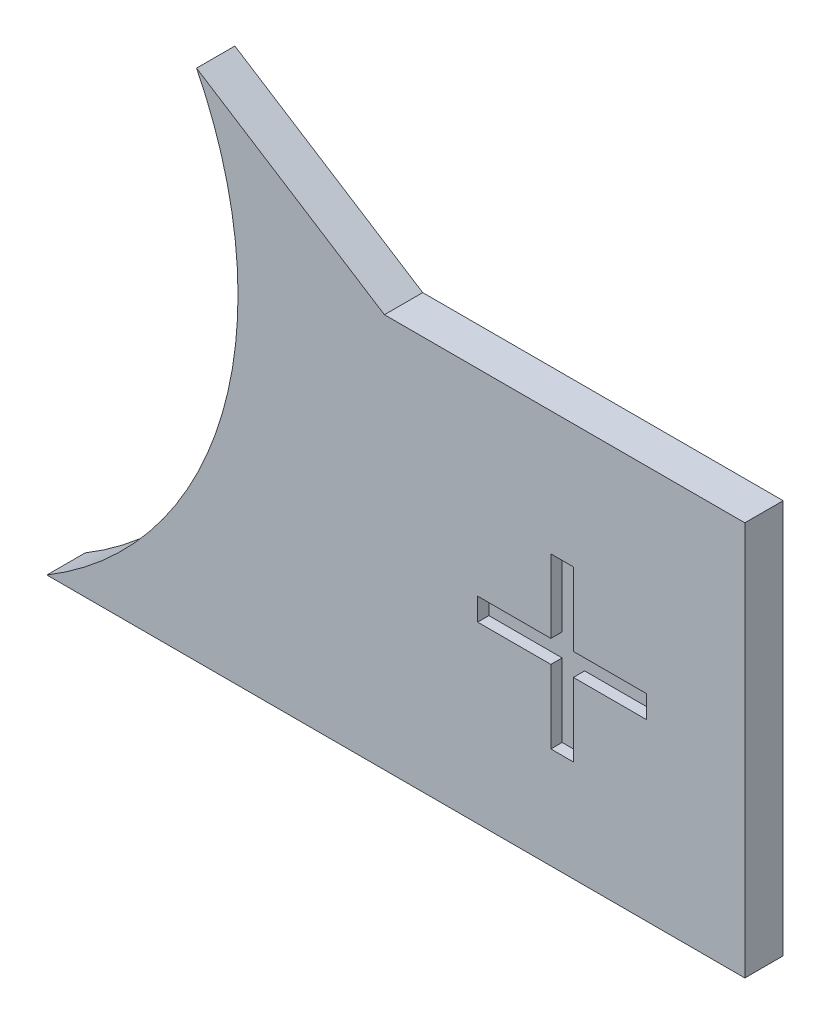
ISO-10303-21;
HEADER;
FILE_DESCRIPTION(('STEP AP214'),'2;1');
FILE_NAME('part.step','',(''),(''),'','','');
FILE_SCHEMA(('AUTOMOTIVE_DESIGN { 1 0 10303 214 1 1 1 1 }'));
ENDSEC;
DATA;
#1=APPLICATION_CONTEXT('core data for automotive mechanical design processes');
#2=APPLICATION_PROTOCOL_DEFINITION('international standard','automotive_design',2000,#1);
#3=PRODUCT_CONTEXT('',#1,'mechanical');
#4=PRODUCT('Part','Part','',(#3));
#5=PRODUCT_RELATED_PRODUCT_CATEGORY('part','',(#4));
#6=PRODUCT_DEFINITION_FORMATION('','',#4);
#7=PRODUCT_DEFINITION_CONTEXT('part definition',#1,'design');
#8=PRODUCT_DEFINITION('design','',#6,#7);
#9=PRODUCT_DEFINITION_SHAPE('','',#8);
#10=(LENGTH_UNIT() NAMED_UNIT(*) SI_UNIT(.MILLI.,.METRE.));
#11=(NAMED_UNIT(*) PLANE_ANGLE_UNIT() SI_UNIT($,.RADIAN.));
#12=(NAMED_UNIT(*) SI_UNIT($,.STERADIAN.) SOLID_ANGLE_UNIT());
#13=UNCERTAINTY_MEASURE_WITH_UNIT(LENGTH_MEASURE(1.E-05),#10,'distance_accuracy_value','');
#14=(GEOMETRIC_REPRESENTATION_CONTEXT(3) GLOBAL_UNCERTAINTY_ASSIGNED_CONTEXT((#13)) GLOBAL_UNIT_ASSIGNED_CONTEXT((#10,
#11,#12)) REPRESENTATION_CONTEXT('',''));
#15=CARTESIAN_POINT('',(0.,0.,0.));
#16=DIRECTION('',(0.,0.,1.));
#17=DIRECTION('',(1.,0.,0.));
#18=AXIS2_PLACEMENT_3D('',#15,#16,#17);
#19=CARTESIAN_POINT('',(0.,0.,3.4));
#20=DIRECTION('',(0.,0.,1.));
#21=DIRECTION('',(1.,0.,0.));
#22=AXIS2_PLACEMENT_3D('',#19,#20,#21);
#23=PLANE('',#22);
#24=CARTESIAN_POINT('',(0.,0.,3.4));
#25=DIRECTION('',(0.,0.,1.));
#26=DIRECTION('',(1.,0.,0.));
#27=AXIS2_PLACEMENT_3D('',#24,#25,#26);
#28=CIRCLE('',#27,35.);
#29=CARTESIAN_POINT('',(18.02775637732,-30.,3.4));
#30=VERTEX_POINT('',#29);
#31=CARTESIAN_POINT('',(31.3204115569061,15.6215178489808,3.4));
#32=VERTEX_POINT('',#31);
#33=EDGE_CURVE('E59',#30,#32,#28,.T.);
#34=ORIENTED_EDGE('',*,*,#33,.F.);
#35=DIRECTION('',(1.,0.,0.));
#36=VECTOR('',#35,1.);
#37=CARTESIAN_POINT('',(0.,-30.,3.4));
#38=LINE('',#37,#36);
#39=CARTESIAN_POINT('',(80.,-30.,3.4));
#40=VERTEX_POINT('',#39);
#41=EDGE_CURVE('E261',#30,#40,#38,.T.);
#42=ORIENTED_EDGE('',*,*,#41,.T.);
#43=DIRECTION('',(0.,1.,0.));
#44=VECTOR('',#43,1.);
#45=CARTESIAN_POINT('',(80.,-30.,3.4));
#46=LINE('',#45,#44);
#47=CARTESIAN_POINT('',(80.,5.,3.4));
#48=VERTEX_POINT('',#47);
#49=EDGE_CURVE('E263',#40,#48,#46,.T.);
#50=ORIENTED_EDGE('',*,*,#49,.T.);
#51=DIRECTION('',(-1.,0.,0.));
#52=VECTOR('',#51,1.);
#53=CARTESIAN_POINT('',(80.,5.,3.4));
#54=LINE('',#53,#52);
#55=CARTESIAN_POINT('',(48.,5.,3.4));
#56=VERTEX_POINT('',#55);
#57=EDGE_CURVE('E266',#48,#56,#54,.T.);
#58=ORIENTED_EDGE('',*,*,#57,.T.);
#59=DIRECTION('',(-0.843495742575284,0.537135860148408,0.));
#60=VECTOR('',#59,1.);
#61=CARTESIAN_POINT('',(48.,5.,3.4));
#62=LINE('',#61,#60);
#63=EDGE_CURVE('E268',#56,#32,#62,.T.);
#64=ORIENTED_EDGE('',*,*,#63,.T.);
#65=EDGE_LOOP('',(#34,#42,#50,#58,#64));
#66=FACE_BOUND('',#65,.T.);
#67=DIRECTION('',(-1.,0.,0.));
#68=VECTOR('',#67,1.);
#69=CARTESIAN_POINT('',(0.,-14.5,3.4));
#70=LINE('',#69,#68);
#71=CARTESIAN_POINT('',(71.2753826404039,-14.5,3.4));
#72=VERTEX_POINT('',#71);
#73=CARTESIAN_POINT('',(64.7753826404039,-14.5,3.4));
#74=VERTEX_POINT('',#73);
#75=EDGE_CURVE('E205',#72,#74,#70,.T.);
#76=ORIENTED_EDGE('',*,*,#75,.T.);
#77=DIRECTION('',(0.,-1.,0.));
#78=VECTOR('',#77,1.);
#79=CARTESIAN_POINT('',(64.7753826404039,0.,3.4));
#80=LINE('',#79,#78);
#81=CARTESIAN_POINT('',(64.7753826404039,-21.,3.4));
#82=VERTEX_POINT('',#81);
#83=EDGE_CURVE('E51',#74,#82,#80,.T.);
#84=ORIENTED_EDGE('',*,*,#83,.T.);
#85=DIRECTION('',(-1.,0.,0.));
#86=VECTOR('',#85,1.);
#87=CARTESIAN_POINT('',(0.,-21.,3.4));
#88=LINE('',#87,#86);
#89=CARTESIAN_POINT('',(62.7753826404039,-21.,3.4));
#90=VERTEX_POINT('',#89);
#91=EDGE_CURVE('E175',#82,#90,#88,.T.);
#92=ORIENTED_EDGE('',*,*,#91,.T.);
#93=DIRECTION('',(0.,-1.,0.));
#94=VECTOR('',#93,1.);
#95=CARTESIAN_POINT('',(62.7753826404039,0.,3.4));
#96=LINE('',#95,#94);
#97=CARTESIAN_POINT('',(62.7753826404039,-14.5,3.4));
#98=VERTEX_POINT('',#97);
#99=EDGE_CURVE('E178',#98,#90,#96,.T.);
#100=ORIENTED_EDGE('',*,*,#99,.F.);
#101=DIRECTION('',(-1.,0.,0.));
#102=VECTOR('',#101,1.);
#103=CARTESIAN_POINT('',(0.,-14.5,3.4));
#104=LINE('',#103,#102);
#105=CARTESIAN_POINT('',(56.2753826404039,-14.5,3.4));
#106=VERTEX_POINT('',#105);
#107=EDGE_CURVE('E228',#98,#106,#104,.T.);
#108=ORIENTED_EDGE('',*,*,#107,.T.);
#109=DIRECTION('',(0.,-1.,0.));
#110=VECTOR('',#109,1.);
#111=CARTESIAN_POINT('',(56.2753826404039,0.,3.4));
#112=LINE('',#111,#110);
#113=CARTESIAN_POINT('',(56.2753826404039,-12.5,3.4));
#114=VERTEX_POINT('',#113);
#115=EDGE_CURVE('E225',#114,#106,#112,.T.);
#116=ORIENTED_EDGE('',*,*,#115,.F.);
#117=DIRECTION('',(-1.,0.,0.));
#118=VECTOR('',#117,1.);
#119=CARTESIAN_POINT('',(0.,-12.5,3.4));
#120=LINE('',#119,#118);
#121=CARTESIAN_POINT('',(62.7753826404039,-12.5,3.4));
#122=VERTEX_POINT('',#121);
#123=EDGE_CURVE('E222',#122,#114,#120,.T.);
#124=ORIENTED_EDGE('',*,*,#123,.F.);
#125=DIRECTION('',(0.,-1.,0.));
#126=VECTOR('',#125,1.);
#127=CARTESIAN_POINT('',(62.7753826404039,0.,3.4));
#128=LINE('',#127,#126);
#129=CARTESIAN_POINT('',(62.7753826404039,-6.00000000000001,3.4));
#130=VERTEX_POINT('',#129);
#131=EDGE_CURVE('E219',#130,#122,#128,.T.);
#132=ORIENTED_EDGE('',*,*,#131,.F.);
#133=DIRECTION('',(-1.,0.,0.));
#134=VECTOR('',#133,1.);
#135=CARTESIAN_POINT('',(0.,-6.00000000000001,3.4));
#136=LINE('',#135,#134);
#137=CARTESIAN_POINT('',(64.7753826404039,-6.00000000000001,3.4));
#138=VERTEX_POINT('',#137);
#139=EDGE_CURVE('E216',#138,#130,#136,.T.);
#140=ORIENTED_EDGE('',*,*,#139,.F.);
#141=DIRECTION('',(0.,-1.,0.));
#142=VECTOR('',#141,1.);
#143=CARTESIAN_POINT('',(64.7753826404039,0.,3.4));
#144=LINE('',#143,#142);
#145=CARTESIAN_POINT('',(64.7753826404039,-12.5,3.4));
#146=VERTEX_POINT('',#145);
#147=EDGE_CURVE('E213',#138,#146,#144,.T.);
#148=ORIENTED_EDGE('',*,*,#147,.T.);
#149=DIRECTION('',(-1.,0.,0.));
#150=VECTOR('',#149,1.);
#151=CARTESIAN_POINT('',(0.,-12.5,3.4));
#152=LINE('',#151,#150);
#153=CARTESIAN_POINT('',(71.2753826404039,-12.5,3.4));
#154=VERTEX_POINT('',#153);
#155=EDGE_CURVE('E210',#154,#146,#152,.T.);
#156=ORIENTED_EDGE('',*,*,#155,.F.);
#157=DIRECTION('',(0.,-1.,0.));
#158=VECTOR('',#157,1.);
#159=CARTESIAN_POINT('',(71.2753826404039,0.,3.4));
#160=LINE('',#159,#158);
#161=EDGE_CURVE('E207',#154,#72,#160,.T.);
#162=ORIENTED_EDGE('',*,*,#161,.T.);
#163=EDGE_LOOP('',(#76,#84,#92,#100,#108,#116,#124,#132,#140,#148,#156,#162));
#164=FACE_BOUND('',#163,.T.);
#165=ADVANCED_FACE('F36',(#66,#164),#23,.T.);
#166=CARTESIAN_POINT('',(0.,0.,0.));
#167=DIRECTION('',(0.,0.,1.));
#168=DIRECTION('',(1.,0.,0.));
#169=AXIS2_PLACEMENT_3D('',#166,#167,#168);
#170=PLANE('',#169);
#171=DIRECTION('',(1.,0.,0.));
#172=VECTOR('',#171,1.);
#173=CARTESIAN_POINT('',(0.,-30.,0.));
#174=LINE('',#173,#172);
#175=CARTESIAN_POINT('',(18.02775637732,-30.,0.));
#176=VERTEX_POINT('',#175);
#177=CARTESIAN_POINT('',(80.,-30.,0.));
#178=VERTEX_POINT('',#177);
#179=EDGE_CURVE('E260',#176,#178,#174,.T.);
#180=ORIENTED_EDGE('',*,*,#179,.F.);
#181=CARTESIAN_POINT('',(0.,0.,0.));
#182=DIRECTION('',(0.,0.,-1.));
#183=DIRECTION('',(-1.,0.,0.));
#184=AXIS2_PLACEMENT_3D('',#181,#182,#183);
#185=CIRCLE('',#184,35.);
#186=CARTESIAN_POINT('',(31.3204115569061,15.6215178489808,0.));
#187=VERTEX_POINT('',#186);
#188=EDGE_CURVE('E235',#187,#176,#185,.T.);
#189=ORIENTED_EDGE('',*,*,#188,.F.);
#190=DIRECTION('',(-0.843495742575284,0.537135860148408,0.));
#191=VECTOR('',#190,1.);
#192=CARTESIAN_POINT('',(48.,5.,0.));
#193=LINE('',#192,#191);
#194=CARTESIAN_POINT('',(48.,5.,0.));
#195=VERTEX_POINT('',#194);
#196=EDGE_CURVE('E264',#195,#187,#193,.T.);
#197=ORIENTED_EDGE('',*,*,#196,.F.);
#198=DIRECTION('',(-1.,0.,0.));
#199=VECTOR('',#198,1.);
#200=CARTESIAN_POINT('',(80.,5.,0.));
#201=LINE('',#200,#199);
#202=CARTESIAN_POINT('',(80.,5.,0.));
#203=VERTEX_POINT('',#202);
#204=EDGE_CURVE('E275',#203,#195,#201,.T.);
#205=ORIENTED_EDGE('',*,*,#204,.F.);
#206=DIRECTION('',(0.,1.,0.));
#207=VECTOR('',#206,1.);
#208=CARTESIAN_POINT('',(80.,-30.,0.));
#209=LINE('',#208,#207);
#210=EDGE_CURVE('E273',#178,#203,#209,.T.);
#211=ORIENTED_EDGE('',*,*,#210,.F.);
#212=EDGE_LOOP('',(#180,#189,#197,#205,#211));
#213=FACE_BOUND('',#212,.T.);
#214=ADVANCED_FACE('F295',(#213),#170,.F.);
#215=CARTESIAN_POINT('',(0.,-30.,3.4));
#216=DIRECTION('',(0.,1.,0.));
#217=DIRECTION('',(-1.,0.,0.));
#218=AXIS2_PLACEMENT_3D('',#215,#216,#217);
#219=PLANE('',#218);
#220=ORIENTED_EDGE('',*,*,#41,.F.);
#221=DIRECTION('',(0.,0.,-1.));
#222=VECTOR('',#221,1.);
#223=CARTESIAN_POINT('',(18.02775637732,-30.,10.));
#224=LINE('',#223,#222);
#225=EDGE_CURVE('E257',#30,#176,#224,.T.);
#226=ORIENTED_EDGE('',*,*,#225,.T.);
#227=ORIENTED_EDGE('',*,*,#179,.T.);
#228=DIRECTION('',(0.,0.,-1.));
#229=VECTOR('',#228,1.);
#230=CARTESIAN_POINT('',(80.,-30.,3.4));
#231=LINE('',#230,#229);
#232=EDGE_CURVE('E44',#40,#178,#231,.T.);
#233=ORIENTED_EDGE('',*,*,#232,.F.);
#234=EDGE_LOOP('',(#220,#226,#227,#233));
#235=FACE_BOUND('',#234,.T.);
#236=ADVANCED_FACE('F38',(#235),#219,.F.);
#237=CARTESIAN_POINT('',(80.,-30.,3.4));
#238=DIRECTION('',(-1.,0.,0.));
#239=DIRECTION('',(0.,0.,1.));
#240=AXIS2_PLACEMENT_3D('',#237,#238,#239);
#241=PLANE('',#240);
#242=ORIENTED_EDGE('',*,*,#210,.T.);
#243=DIRECTION('',(0.,0.,-1.));
#244=VECTOR('',#243,1.);
#245=CARTESIAN_POINT('',(80.,5.,3.4));
#246=LINE('',#245,#244);
#247=EDGE_CURVE('E281',#48,#203,#246,.T.);
#248=ORIENTED_EDGE('',*,*,#247,.F.);
#249=ORIENTED_EDGE('',*,*,#49,.F.);
#250=ORIENTED_EDGE('',*,*,#232,.T.);
#251=EDGE_LOOP('',(#242,#248,#249,#250));
#252=FACE_BOUND('',#251,.T.);
#253=ADVANCED_FACE('F288',(#252),#241,.F.);
#254=CARTESIAN_POINT('',(80.,5.,3.4));
#255=DIRECTION('',(0.,-1.,0.));
#256=DIRECTION('',(1.,0.,0.));
#257=AXIS2_PLACEMENT_3D('',#254,#255,#256);
#258=PLANE('',#257);
#259=ORIENTED_EDGE('',*,*,#204,.T.);
#260=DIRECTION('',(0.,0.,-1.));
#261=VECTOR('',#260,1.);
#262=CARTESIAN_POINT('',(48.,5.,3.4));
#263=LINE('',#262,#261);
#264=EDGE_CURVE('E271',#56,#195,#263,.T.);
#265=ORIENTED_EDGE('',*,*,#264,.F.);
#266=ORIENTED_EDGE('',*,*,#57,.F.);
#267=ORIENTED_EDGE('',*,*,#247,.T.);
#268=EDGE_LOOP('',(#259,#265,#266,#267));
#269=FACE_BOUND('',#268,.T.);
#270=ADVANCED_FACE('F300',(#269),#258,.F.);
#271=CARTESIAN_POINT('',(48.,5.,3.4));
#272=DIRECTION('',(-0.537135860148408,-0.843495742575284,0.));
#273=DIRECTION('',(0.843495742575284,-0.537135860148408,0.));
#274=AXIS2_PLACEMENT_3D('',#271,#272,#273);
#275=PLANE('',#274);
#276=ORIENTED_EDGE('',*,*,#196,.T.);
#277=DIRECTION('',(0.,0.,-1.));
#278=VECTOR('',#277,1.);
#279=CARTESIAN_POINT('',(31.3204115569061,15.6215178489808,10.));
#280=LINE('',#279,#278);
#281=EDGE_CURVE('E11',#187,#32,#280,.F.);
#282=ORIENTED_EDGE('',*,*,#281,.T.);
#283=ORIENTED_EDGE('',*,*,#63,.F.);
#284=ORIENTED_EDGE('',*,*,#264,.T.);
#285=EDGE_LOOP('',(#276,#282,#283,#284));
#286=FACE_BOUND('',#285,.T.);
#287=ADVANCED_FACE('F304',(#286),#275,.F.);
#288=CARTESIAN_POINT('',(0.,0.,10.));
#289=DIRECTION('',(0.,0.,-1.));
#290=DIRECTION('',(-1.,0.,0.));
#291=AXIS2_PLACEMENT_3D('',#288,#289,#290);
#292=CYLINDRICAL_SURFACE('',#291,35.);
#293=ORIENTED_EDGE('',*,*,#33,.T.);
#294=ORIENTED_EDGE('',*,*,#281,.F.);
#295=ORIENTED_EDGE('',*,*,#188,.T.);
#296=ORIENTED_EDGE('',*,*,#225,.F.);
#297=EDGE_LOOP('',(#293,#294,#295,#296));
#298=FACE_BOUND('',#297,.T.);
#299=ADVANCED_FACE('F307',(#298),#292,.F.);
#300=CARTESIAN_POINT('',(64.7753826404039,0.,2.4));
#301=DIRECTION('',(-1.,0.,0.));
#302=DIRECTION('',(0.,0.,1.));
#303=AXIS2_PLACEMENT_3D('',#300,#301,#302);
#304=PLANE('',#303);
#305=ORIENTED_EDGE('',*,*,#83,.F.);
#306=DIRECTION('',(0.,0.,1.));
#307=VECTOR('',#306,1.);
#308=CARTESIAN_POINT('',(64.7753826404039,-14.5,2.4));
#309=LINE('',#308,#307);
#310=CARTESIAN_POINT('',(64.7753826404039,-14.5,2.4));
#311=VERTEX_POINT('',#310);
#312=EDGE_CURVE('E159',#311,#74,#309,.T.);
#313=ORIENTED_EDGE('',*,*,#312,.F.);
#314=DIRECTION('',(0.,-1.,0.));
#315=VECTOR('',#314,1.);
#316=CARTESIAN_POINT('',(64.7753826404039,0.,2.4));
#317=LINE('',#316,#315);
#318=CARTESIAN_POINT('',(64.7753826404039,-21.,2.4));
#319=VERTEX_POINT('',#318);
#320=EDGE_CURVE('E166',#311,#319,#317,.T.);
#321=ORIENTED_EDGE('',*,*,#320,.T.);
#322=DIRECTION('',(0.,0.,1.));
#323=VECTOR('',#322,1.);
#324=CARTESIAN_POINT('',(64.7753826404039,-21.,2.4));
#325=LINE('',#324,#323);
#326=EDGE_CURVE('E233',#319,#82,#325,.T.);
#327=ORIENTED_EDGE('',*,*,#326,.T.);
#328=EDGE_LOOP('',(#305,#313,#321,#327));
#329=FACE_BOUND('',#328,.T.);
#330=ADVANCED_FACE('F169',(#329),#304,.T.);
#331=CARTESIAN_POINT('',(0.,-21.,2.4));
#332=DIRECTION('',(0.,1.,0.));
#333=DIRECTION('',(0.,0.,1.));
#334=AXIS2_PLACEMENT_3D('',#331,#332,#333);
#335=PLANE('',#334);
#336=ORIENTED_EDGE('',*,*,#91,.F.);
#337=ORIENTED_EDGE('',*,*,#326,.F.);
#338=DIRECTION('',(-1.,0.,0.));
#339=VECTOR('',#338,1.);
#340=CARTESIAN_POINT('',(0.,-21.,2.4));
#341=LINE('',#340,#339);
#342=CARTESIAN_POINT('',(62.7753826404039,-21.,2.4));
#343=VERTEX_POINT('',#342);
#344=EDGE_CURVE('E171',#319,#343,#341,.T.);
#345=ORIENTED_EDGE('',*,*,#344,.T.);
#346=DIRECTION('',(0.,0.,1.));
#347=VECTOR('',#346,1.);
#348=CARTESIAN_POINT('',(62.7753826404039,-21.,2.4));
#349=LINE('',#348,#347);
#350=EDGE_CURVE('E236',#343,#90,#349,.T.);
#351=ORIENTED_EDGE('',*,*,#350,.T.);
#352=EDGE_LOOP('',(#336,#337,#345,#351));
#353=FACE_BOUND('',#352,.T.);
#354=ADVANCED_FACE('F314',(#353),#335,.T.);
#355=CARTESIAN_POINT('',(62.7753826404039,0.,2.4));
#356=DIRECTION('',(-1.,0.,0.));
#357=DIRECTION('',(0.,0.,1.));
#358=AXIS2_PLACEMENT_3D('',#355,#356,#357);
#359=PLANE('',#358);
#360=ORIENTED_EDGE('',*,*,#99,.T.);
#361=ORIENTED_EDGE('',*,*,#350,.F.);
#362=DIRECTION('',(0.,-1.,0.));
#363=VECTOR('',#362,1.);
#364=CARTESIAN_POINT('',(62.7753826404039,0.,2.4));
#365=LINE('',#364,#363);
#366=CARTESIAN_POINT('',(62.7753826404039,-14.5,2.4));
#367=VERTEX_POINT('',#366);
#368=EDGE_CURVE('E201',#367,#343,#365,.T.);
#369=ORIENTED_EDGE('',*,*,#368,.F.);
#370=DIRECTION('',(0.,0.,1.));
#371=VECTOR('',#370,1.);
#372=CARTESIAN_POINT('',(62.7753826404039,-14.5,2.4));
#373=LINE('',#372,#371);
#374=EDGE_CURVE('E238',#367,#98,#373,.T.);
#375=ORIENTED_EDGE('',*,*,#374,.T.);
#376=EDGE_LOOP('',(#360,#361,#369,#375));
#377=FACE_BOUND('',#376,.T.);
#378=ADVANCED_FACE('F376',(#377),#359,.F.);
#379=CARTESIAN_POINT('',(0.,-14.5,2.4));
#380=DIRECTION('',(0.,1.,0.));
#381=DIRECTION('',(-1.,0.,0.));
#382=AXIS2_PLACEMENT_3D('',#379,#380,#381);
#383=PLANE('',#382);
#384=ORIENTED_EDGE('',*,*,#107,.F.);
#385=ORIENTED_EDGE('',*,*,#374,.F.);
#386=DIRECTION('',(-1.,0.,0.));
#387=VECTOR('',#386,1.);
#388=CARTESIAN_POINT('',(0.,-14.5,2.4));
#389=LINE('',#388,#387);
#390=CARTESIAN_POINT('',(56.2753826404039,-14.5,2.4));
#391=VERTEX_POINT('',#390);
#392=EDGE_CURVE('E199',#367,#391,#389,.T.);
#393=ORIENTED_EDGE('',*,*,#392,.T.);
#394=DIRECTION('',(0.,0.,1.));
#395=VECTOR('',#394,1.);
#396=CARTESIAN_POINT('',(56.2753826404039,-14.5,2.4));
#397=LINE('',#396,#395);
#398=EDGE_CURVE('E240',#391,#106,#397,.T.);
#399=ORIENTED_EDGE('',*,*,#398,.T.);
#400=EDGE_LOOP('',(#384,#385,#393,#399));
#401=FACE_BOUND('',#400,.T.);
#402=ADVANCED_FACE('F386',(#401),#383,.T.);
#403=CARTESIAN_POINT('',(56.2753826404039,0.,2.4));
#404=DIRECTION('',(-1.,0.,0.));
#405=DIRECTION('',(0.,0.,1.));
#406=AXIS2_PLACEMENT_3D('',#403,#404,#405);
#407=PLANE('',#406);
#408=ORIENTED_EDGE('',*,*,#115,.T.);
#409=ORIENTED_EDGE('',*,*,#398,.F.);
#410=DIRECTION('',(0.,-1.,0.));
#411=VECTOR('',#410,1.);
#412=CARTESIAN_POINT('',(56.2753826404039,0.,2.4));
#413=LINE('',#412,#411);
#414=CARTESIAN_POINT('',(56.2753826404039,-12.5,2.4));
#415=VERTEX_POINT('',#414);
#416=EDGE_CURVE('E196',#415,#391,#413,.T.);
#417=ORIENTED_EDGE('',*,*,#416,.F.);
#418=DIRECTION('',(0.,0.,1.));
#419=VECTOR('',#418,1.);
#420=CARTESIAN_POINT('',(56.2753826404039,-12.5,2.4));
#421=LINE('',#420,#419);
#422=EDGE_CURVE('E242',#415,#114,#421,.T.);
#423=ORIENTED_EDGE('',*,*,#422,.T.);
#424=EDGE_LOOP('',(#408,#409,#417,#423));
#425=FACE_BOUND('',#424,.T.);
#426=ADVANCED_FACE('F396',(#425),#407,.F.);
#427=CARTESIAN_POINT('',(0.,-12.5,2.4));
#428=DIRECTION('',(0.,1.,0.));
#429=DIRECTION('',(0.,0.,1.));
#430=AXIS2_PLACEMENT_3D('',#427,#428,#429);
#431=PLANE('',#430);
#432=ORIENTED_EDGE('',*,*,#123,.T.);
#433=ORIENTED_EDGE('',*,*,#422,.F.);
#434=DIRECTION('',(-1.,0.,0.));
#435=VECTOR('',#434,1.);
#436=CARTESIAN_POINT('',(0.,-12.5,2.4));
#437=LINE('',#436,#435);
#438=CARTESIAN_POINT('',(62.7753826404039,-12.5,2.4));
#439=VERTEX_POINT('',#438);
#440=EDGE_CURVE('E193',#439,#415,#437,.T.);
#441=ORIENTED_EDGE('',*,*,#440,.F.);
#442=DIRECTION('',(0.,0.,1.));
#443=VECTOR('',#442,1.);
#444=CARTESIAN_POINT('',(62.7753826404039,-12.5,2.4));
#445=LINE('',#444,#443);
#446=EDGE_CURVE('E244',#439,#122,#445,.T.);
#447=ORIENTED_EDGE('',*,*,#446,.T.);
#448=EDGE_LOOP('',(#432,#433,#441,#447));
#449=FACE_BOUND('',#448,.T.);
#450=ADVANCED_FACE('F406',(#449),#431,.F.);
#451=CARTESIAN_POINT('',(62.7753826404039,0.,2.4));
#452=DIRECTION('',(-1.,0.,0.));
#453=DIRECTION('',(0.,0.,1.));
#454=AXIS2_PLACEMENT_3D('',#451,#452,#453);
#455=PLANE('',#454);
#456=ORIENTED_EDGE('',*,*,#131,.T.);
#457=ORIENTED_EDGE('',*,*,#446,.F.);
#458=DIRECTION('',(0.,-1.,0.));
#459=VECTOR('',#458,1.);
#460=CARTESIAN_POINT('',(62.7753826404039,0.,2.4));
#461=LINE('',#460,#459);
#462=CARTESIAN_POINT('',(62.7753826404039,-6.00000000000001,2.4));
#463=VERTEX_POINT('',#462);
#464=EDGE_CURVE('E190',#463,#439,#461,.T.);
#465=ORIENTED_EDGE('',*,*,#464,.F.);
#466=DIRECTION('',(0.,0.,1.));
#467=VECTOR('',#466,1.);
#468=CARTESIAN_POINT('',(62.7753826404039,-6.00000000000001,2.4));
#469=LINE('',#468,#467);
#470=EDGE_CURVE('E246',#463,#130,#469,.T.);
#471=ORIENTED_EDGE('',*,*,#470,.T.);
#472=EDGE_LOOP('',(#456,#457,#465,#471));
#473=FACE_BOUND('',#472,.T.);
#474=ADVANCED_FACE('F416',(#473),#455,.F.);
#475=CARTESIAN_POINT('',(0.,-6.00000000000001,2.4));
#476=DIRECTION('',(0.,1.,0.));
#477=DIRECTION('',(0.,0.,1.));
#478=AXIS2_PLACEMENT_3D('',#475,#476,#477);
#479=PLANE('',#478);
#480=ORIENTED_EDGE('',*,*,#139,.T.);
#481=ORIENTED_EDGE('',*,*,#470,.F.);
#482=DIRECTION('',(-1.,0.,0.));
#483=VECTOR('',#482,1.);
#484=CARTESIAN_POINT('',(0.,-6.00000000000001,2.4));
#485=LINE('',#484,#483);
#486=CARTESIAN_POINT('',(64.7753826404039,-6.00000000000001,2.4));
#487=VERTEX_POINT('',#486);
#488=EDGE_CURVE('E187',#487,#463,#485,.T.);
#489=ORIENTED_EDGE('',*,*,#488,.F.);
#490=DIRECTION('',(0.,0.,1.));
#491=VECTOR('',#490,1.);
#492=CARTESIAN_POINT('',(64.7753826404039,-6.00000000000001,2.4));
#493=LINE('',#492,#491);
#494=EDGE_CURVE('E248',#487,#138,#493,.T.);
#495=ORIENTED_EDGE('',*,*,#494,.T.);
#496=EDGE_LOOP('',(#480,#481,#489,#495));
#497=FACE_BOUND('',#496,.T.);
#498=ADVANCED_FACE('F426',(#497),#479,.F.);
#499=CARTESIAN_POINT('',(64.7753826404039,0.,2.4));
#500=DIRECTION('',(-1.,0.,0.));
#501=DIRECTION('',(0.,0.,1.));
#502=AXIS2_PLACEMENT_3D('',#499,#500,#501);
#503=PLANE('',#502);
#504=ORIENTED_EDGE('',*,*,#147,.F.);
#505=ORIENTED_EDGE('',*,*,#494,.F.);
#506=DIRECTION('',(0.,-1.,0.));
#507=VECTOR('',#506,1.);
#508=CARTESIAN_POINT('',(64.7753826404039,0.,2.4));
#509=LINE('',#508,#507);
#510=CARTESIAN_POINT('',(64.7753826404039,-12.5,2.4));
#511=VERTEX_POINT('',#510);
#512=EDGE_CURVE('E185',#487,#511,#509,.T.);
#513=ORIENTED_EDGE('',*,*,#512,.T.);
#514=DIRECTION('',(0.,0.,1.));
#515=VECTOR('',#514,1.);
#516=CARTESIAN_POINT('',(64.7753826404039,-12.5,2.4));
#517=LINE('',#516,#515);
#518=EDGE_CURVE('E250',#511,#146,#517,.T.);
#519=ORIENTED_EDGE('',*,*,#518,.T.);
#520=EDGE_LOOP('',(#504,#505,#513,#519));
#521=FACE_BOUND('',#520,.T.);
#522=ADVANCED_FACE('F436',(#521),#503,.T.);
#523=CARTESIAN_POINT('',(0.,-12.5,2.4));
#524=DIRECTION('',(0.,1.,0.));
#525=DIRECTION('',(0.,0.,1.));
#526=AXIS2_PLACEMENT_3D('',#523,#524,#525);
#527=PLANE('',#526);
#528=ORIENTED_EDGE('',*,*,#155,.T.);
#529=ORIENTED_EDGE('',*,*,#518,.F.);
#530=DIRECTION('',(-1.,0.,0.));
#531=VECTOR('',#530,1.);
#532=CARTESIAN_POINT('',(0.,-12.5,2.4));
#533=LINE('',#532,#531);
#534=CARTESIAN_POINT('',(71.2753826404039,-12.5,2.4));
#535=VERTEX_POINT('',#534);
#536=EDGE_CURVE('E182',#535,#511,#533,.T.);
#537=ORIENTED_EDGE('',*,*,#536,.F.);
#538=DIRECTION('',(0.,0.,1.));
#539=VECTOR('',#538,1.);
#540=CARTESIAN_POINT('',(71.2753826404039,-12.5,2.4));
#541=LINE('',#540,#539);
#542=EDGE_CURVE('E252',#535,#154,#541,.T.);
#543=ORIENTED_EDGE('',*,*,#542,.T.);
#544=EDGE_LOOP('',(#528,#529,#537,#543));
#545=FACE_BOUND('',#544,.T.);
#546=ADVANCED_FACE('F446',(#545),#527,.F.);
#547=CARTESIAN_POINT('',(71.2753826404039,0.,2.4));
#548=DIRECTION('',(-1.,0.,0.));
#549=DIRECTION('',(0.,0.,1.));
#550=AXIS2_PLACEMENT_3D('',#547,#548,#549);
#551=PLANE('',#550);
#552=ORIENTED_EDGE('',*,*,#161,.F.);
#553=ORIENTED_EDGE('',*,*,#542,.F.);
#554=DIRECTION('',(0.,-1.,0.));
#555=VECTOR('',#554,1.);
#556=CARTESIAN_POINT('',(71.2753826404039,0.,2.4));
#557=LINE('',#556,#555);
#558=CARTESIAN_POINT('',(71.2753826404039,-14.5,2.4));
#559=VERTEX_POINT('',#558);
#560=EDGE_CURVE('E165',#535,#559,#557,.T.);
#561=ORIENTED_EDGE('',*,*,#560,.T.);
#562=DIRECTION('',(0.,0.,1.));
#563=VECTOR('',#562,1.);
#564=CARTESIAN_POINT('',(71.2753826404039,-14.5,2.4));
#565=LINE('',#564,#563);
#566=EDGE_CURVE('E161',#559,#72,#565,.T.);
#567=ORIENTED_EDGE('',*,*,#566,.T.);
#568=EDGE_LOOP('',(#552,#553,#561,#567));
#569=FACE_BOUND('',#568,.T.);
#570=ADVANCED_FACE('F456',(#569),#551,.T.);
#571=CARTESIAN_POINT('',(0.,-14.5,2.4));
#572=DIRECTION('',(0.,1.,0.));
#573=DIRECTION('',(0.,0.,1.));
#574=AXIS2_PLACEMENT_3D('',#571,#572,#573);
#575=PLANE('',#574);
#576=ORIENTED_EDGE('',*,*,#75,.F.);
#577=ORIENTED_EDGE('',*,*,#566,.F.);
#578=DIRECTION('',(-1.,0.,0.));
#579=VECTOR('',#578,1.);
#580=CARTESIAN_POINT('',(0.,-14.5,2.4));
#581=LINE('',#580,#579);
#582=EDGE_CURVE('E156',#559,#311,#581,.T.);
#583=ORIENTED_EDGE('',*,*,#582,.T.);
#584=ORIENTED_EDGE('',*,*,#312,.T.);
#585=EDGE_LOOP('',(#576,#577,#583,#584));
#586=FACE_BOUND('',#585,.T.);
#587=ADVANCED_FACE('F158',(#586),#575,.T.);
#588=CARTESIAN_POINT('',(0.,0.,2.4));
#589=DIRECTION('',(0.,0.,1.));
#590=DIRECTION('',(1.,0.,0.));
#591=AXIS2_PLACEMENT_3D('',#588,#589,#590);
#592=PLANE('',#591);
#593=ORIENTED_EDGE('',*,*,#320,.F.);
#594=ORIENTED_EDGE('',*,*,#582,.F.);
#595=ORIENTED_EDGE('',*,*,#560,.F.);
#596=ORIENTED_EDGE('',*,*,#536,.T.);
#597=ORIENTED_EDGE('',*,*,#512,.F.);
#598=ORIENTED_EDGE('',*,*,#488,.T.);
#599=ORIENTED_EDGE('',*,*,#464,.T.);
#600=ORIENTED_EDGE('',*,*,#440,.T.);
#601=ORIENTED_EDGE('',*,*,#416,.T.);
#602=ORIENTED_EDGE('',*,*,#392,.F.);
#603=ORIENTED_EDGE('',*,*,#368,.T.);
#604=ORIENTED_EDGE('',*,*,#344,.F.);
#605=EDGE_LOOP('',(#593,#594,#595,#596,#597,#598,#599,#600,#601,#602,#603,#604));
#606=FACE_BOUND('',#605,.T.);
#607=ADVANCED_FACE('F173',(#606),#592,.T.);
#608=CLOSED_SHELL('',(#165,#214,#236,#253,#270,#287,#299,#330,#354,#378,#402,#426,#450,#474,
#498,#522,#546,#570,#587,#607));
#609=MANIFOLD_SOLID_BREP('B2',#608);
#610=ADVANCED_BREP_SHAPE_REPRESENTATION('',(#18,#609),#14);
#611=SHAPE_DEFINITION_REPRESENTATION(#9,#610);
ENDSEC;
END-ISO-10303-21;
